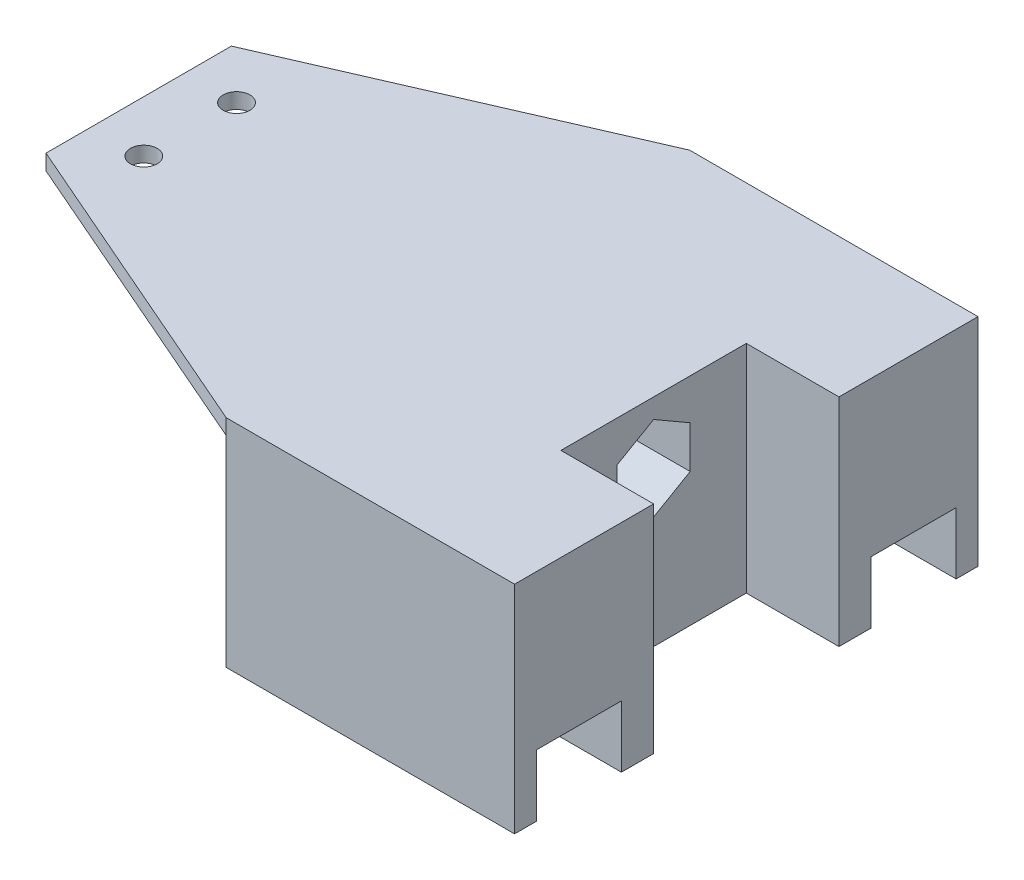
ISO-10303-21;
HEADER;
FILE_DESCRIPTION(('STEP AP214'),'2;1');
FILE_NAME('part.step','',(''),(''),'','','');
FILE_SCHEMA(('AUTOMOTIVE_DESIGN { 1 0 10303 214 1 1 1 1 }'));
ENDSEC;
DATA;
#1=APPLICATION_CONTEXT('core data for automotive mechanical design processes');
#2=APPLICATION_PROTOCOL_DEFINITION('international standard','automotive_design',2000,#1);
#3=PRODUCT_CONTEXT('',#1,'mechanical');
#4=PRODUCT('Part','Part','',(#3));
#5=PRODUCT_RELATED_PRODUCT_CATEGORY('part','',(#4));
#6=PRODUCT_DEFINITION_FORMATION('','',#4);
#7=PRODUCT_DEFINITION_CONTEXT('part definition',#1,'design');
#8=PRODUCT_DEFINITION('design','',#6,#7);
#9=PRODUCT_DEFINITION_SHAPE('','',#8);
#10=(LENGTH_UNIT() NAMED_UNIT(*) SI_UNIT(.MILLI.,.METRE.));
#11=(NAMED_UNIT(*) PLANE_ANGLE_UNIT() SI_UNIT($,.RADIAN.));
#12=(NAMED_UNIT(*) SI_UNIT($,.STERADIAN.) SOLID_ANGLE_UNIT());
#13=UNCERTAINTY_MEASURE_WITH_UNIT(LENGTH_MEASURE(1.E-05),#10,'distance_accuracy_value','');
#14=(GEOMETRIC_REPRESENTATION_CONTEXT(3) GLOBAL_UNCERTAINTY_ASSIGNED_CONTEXT((#13)) GLOBAL_UNIT_ASSIGNED_CONTEXT((#10,
#11,#12)) REPRESENTATION_CONTEXT('',''));
#15=CARTESIAN_POINT('',(0.,0.,0.));
#16=DIRECTION('',(0.,0.,1.));
#17=DIRECTION('',(1.,0.,0.));
#18=AXIS2_PLACEMENT_3D('',#15,#16,#17);
#19=CARTESIAN_POINT('',(-14.,0.,0.));
#20=DIRECTION('',(-1.,0.,0.));
#21=DIRECTION('',(0.,0.,1.));
#22=AXIS2_PLACEMENT_3D('',#19,#20,#21);
#23=PLANE('',#22);
#24=DIRECTION('',(0.,-1.,0.));
#25=VECTOR('',#24,1.);
#26=CARTESIAN_POINT('',(-14.,0.,22.5));
#27=LINE('',#26,#25);
#28=CARTESIAN_POINT('',(-14.,19.5,22.5));
#29=VERTEX_POINT('',#28);
#30=CARTESIAN_POINT('',(-14.,0.,22.5));
#31=VERTEX_POINT('',#30);
#32=EDGE_CURVE('E60',#29,#31,#27,.T.);
#33=ORIENTED_EDGE('',*,*,#32,.F.);
#34=DIRECTION('',(0.,0.,-1.));
#35=VECTOR('',#34,1.);
#36=CARTESIAN_POINT('',(-14.,19.5,0.));
#37=LINE('',#36,#35);
#38=CARTESIAN_POINT('',(-14.,19.5,9.00000000000001));
#39=VERTEX_POINT('',#38);
#40=EDGE_CURVE('E274',#29,#39,#37,.T.);
#41=ORIENTED_EDGE('',*,*,#40,.T.);
#42=DIRECTION('',(0.,1.,0.));
#43=VECTOR('',#42,1.);
#44=CARTESIAN_POINT('',(-14.,0.,9.00000000000001));
#45=LINE('',#44,#43);
#46=CARTESIAN_POINT('',(-14.,0.,9.00000000000001));
#47=VERTEX_POINT('',#46);
#48=EDGE_CURVE('E332',#47,#39,#45,.T.);
#49=ORIENTED_EDGE('',*,*,#48,.F.);
#50=DIRECTION('',(0.,0.,-1.));
#51=VECTOR('',#50,1.);
#52=CARTESIAN_POINT('',(-14.,0.,12.125));
#53=LINE('',#52,#51);
#54=CARTESIAN_POINT('',(-14.,0.,12.125));
#55=VERTEX_POINT('',#54);
#56=EDGE_CURVE('E394',#55,#47,#53,.T.);
#57=ORIENTED_EDGE('',*,*,#56,.F.);
#58=DIRECTION('',(0.,-1.,0.));
#59=VECTOR('',#58,1.);
#60=CARTESIAN_POINT('',(-14.,0.,12.125));
#61=LINE('',#60,#59);
#62=CARTESIAN_POINT('',(-14.,6.,12.125));
#63=VERTEX_POINT('',#62);
#64=EDGE_CURVE('E391',#63,#55,#61,.T.);
#65=ORIENTED_EDGE('',*,*,#64,.F.);
#66=DIRECTION('',(0.,0.,-1.));
#67=VECTOR('',#66,1.);
#68=CARTESIAN_POINT('',(-14.,6.,20.375));
#69=LINE('',#68,#67);
#70=CARTESIAN_POINT('',(-14.,6.,20.375));
#71=VERTEX_POINT('',#70);
#72=EDGE_CURVE('E389',#71,#63,#69,.T.);
#73=ORIENTED_EDGE('',*,*,#72,.F.);
#74=DIRECTION('',(0.,1.,0.));
#75=VECTOR('',#74,1.);
#76=CARTESIAN_POINT('',(-14.,0.,20.375));
#77=LINE('',#76,#75);
#78=CARTESIAN_POINT('',(-14.,0.,20.375));
#79=VERTEX_POINT('',#78);
#80=EDGE_CURVE('E387',#79,#71,#77,.T.);
#81=ORIENTED_EDGE('',*,*,#80,.F.);
#82=DIRECTION('',(0.,0.,-1.));
#83=VECTOR('',#82,1.);
#84=CARTESIAN_POINT('',(-14.,0.,20.375));
#85=LINE('',#84,#83);
#86=EDGE_CURVE('E353',#31,#79,#85,.T.);
#87=ORIENTED_EDGE('',*,*,#86,.F.);
#88=EDGE_LOOP('',(#33,#41,#49,#57,#65,#73,#81,#87));
#89=FACE_BOUND('',#88,.T.);
#90=ADVANCED_FACE('F37',(#89),#23,.T.);
#91=DIRECTION('',(0.,-1.,0.));
#92=VECTOR('',#91,1.);
#93=CARTESIAN_POINT('',(-14.,0.,-8.99999999999999));
#94=LINE('',#93,#92);
#95=CARTESIAN_POINT('',(-14.,19.5,-8.99999999999999));
#96=VERTEX_POINT('',#95);
#97=CARTESIAN_POINT('',(-14.,0.,-8.99999999999999));
#98=VERTEX_POINT('',#97);
#99=EDGE_CURVE('E330',#96,#98,#94,.T.);
#100=ORIENTED_EDGE('',*,*,#99,.F.);
#101=DIRECTION('',(0.,0.,-1.));
#102=VECTOR('',#101,1.);
#103=CARTESIAN_POINT('',(-14.,19.5,0.));
#104=LINE('',#103,#102);
#105=CARTESIAN_POINT('',(-14.,19.5,-22.5));
#106=VERTEX_POINT('',#105);
#107=EDGE_CURVE('E52',#96,#106,#104,.T.);
#108=ORIENTED_EDGE('',*,*,#107,.T.);
#109=DIRECTION('',(0.,1.,0.));
#110=VECTOR('',#109,1.);
#111=CARTESIAN_POINT('',(-14.,0.,-22.5));
#112=LINE('',#111,#110);
#113=CARTESIAN_POINT('',(-14.,0.,-22.5));
#114=VERTEX_POINT('',#113);
#115=EDGE_CURVE('E405',#114,#106,#112,.T.);
#116=ORIENTED_EDGE('',*,*,#115,.F.);
#117=DIRECTION('',(0.,0.,-1.));
#118=VECTOR('',#117,1.);
#119=CARTESIAN_POINT('',(-14.,0.,-20.375));
#120=LINE('',#119,#118);
#121=CARTESIAN_POINT('',(-14.,0.,-20.375));
#122=VERTEX_POINT('',#121);
#123=EDGE_CURVE('E403',#122,#114,#120,.T.);
#124=ORIENTED_EDGE('',*,*,#123,.F.);
#125=DIRECTION('',(0.,-1.,0.));
#126=VECTOR('',#125,1.);
#127=CARTESIAN_POINT('',(-14.,0.,-20.375));
#128=LINE('',#127,#126);
#129=CARTESIAN_POINT('',(-14.,6.,-20.375));
#130=VERTEX_POINT('',#129);
#131=EDGE_CURVE('E401',#130,#122,#128,.T.);
#132=ORIENTED_EDGE('',*,*,#131,.F.);
#133=DIRECTION('',(0.,0.,-1.));
#134=VECTOR('',#133,1.);
#135=CARTESIAN_POINT('',(-14.,6.,-20.375));
#136=LINE('',#135,#134);
#137=CARTESIAN_POINT('',(-14.,6.,-12.125));
#138=VERTEX_POINT('',#137);
#139=EDGE_CURVE('E399',#138,#130,#136,.T.);
#140=ORIENTED_EDGE('',*,*,#139,.F.);
#141=DIRECTION('',(0.,1.,0.));
#142=VECTOR('',#141,1.);
#143=CARTESIAN_POINT('',(-14.,0.,-12.125));
#144=LINE('',#143,#142);
#145=CARTESIAN_POINT('',(-14.,0.,-12.125));
#146=VERTEX_POINT('',#145);
#147=EDGE_CURVE('E397',#146,#138,#144,.T.);
#148=ORIENTED_EDGE('',*,*,#147,.F.);
#149=EDGE_CURVE('E393',#98,#146,#53,.T.);
#150=ORIENTED_EDGE('',*,*,#149,.F.);
#151=EDGE_LOOP('',(#100,#108,#116,#124,#132,#140,#148,#150));
#152=FACE_BOUND('',#151,.T.);
#153=ADVANCED_FACE('F531',(#152),#23,.T.);
#154=CARTESIAN_POINT('',(-5.,-25.4558441227157,-8.99999999999999));
#155=DIRECTION('',(1.,0.,0.));
#156=DIRECTION('',(0.,0.,-1.));
#157=AXIS2_PLACEMENT_3D('',#154,#155,#156);
#158=PLANE('',#157);
#159=DIRECTION('',(0.,-0.5,-0.866025403784439));
#160=VECTOR('',#159,1.);
#161=CARTESIAN_POINT('',(-5.,12.9504065443768,3.54999999999999));
#162=LINE('',#161,#160);
#163=CARTESIAN_POINT('',(-5.,12.9504065443768,3.54999999999999));
#164=VERTEX_POINT('',#163);
#165=CARTESIAN_POINT('',(-5.,10.9008130887537,0.));
#166=VERTEX_POINT('',#165);
#167=EDGE_CURVE('E322',#164,#166,#162,.T.);
#168=ORIENTED_EDGE('',*,*,#167,.T.);
#169=DIRECTION('',(0.,0.5,-0.866025403784438));
#170=VECTOR('',#169,1.);
#171=CARTESIAN_POINT('',(-5.,10.9008130887537,0.));
#172=LINE('',#171,#170);
#173=CARTESIAN_POINT('',(-5.,12.9504065443768,-3.55000000000001));
#174=VERTEX_POINT('',#173);
#175=EDGE_CURVE('E320',#166,#174,#172,.T.);
#176=ORIENTED_EDGE('',*,*,#175,.T.);
#177=DIRECTION('',(0.,1.,0.));
#178=VECTOR('',#177,1.);
#179=CARTESIAN_POINT('',(-5.,12.9504065443768,-3.55000000000001));
#180=LINE('',#179,#178);
#181=CARTESIAN_POINT('',(-5.,17.0495934556232,-3.55000000000001));
#182=VERTEX_POINT('',#181);
#183=EDGE_CURVE('E318',#174,#182,#180,.T.);
#184=ORIENTED_EDGE('',*,*,#183,.T.);
#185=DIRECTION('',(0.,0.5,0.866025403784438));
#186=VECTOR('',#185,1.);
#187=CARTESIAN_POINT('',(-5.,17.0495934556232,-3.55));
#188=LINE('',#187,#186);
#189=CARTESIAN_POINT('',(-5.,19.0991869112463,0.));
#190=VERTEX_POINT('',#189);
#191=EDGE_CURVE('E316',#182,#190,#188,.T.);
#192=ORIENTED_EDGE('',*,*,#191,.T.);
#193=DIRECTION('',(0.,-0.500000000000001,0.866025403784438));
#194=VECTOR('',#193,1.);
#195=CARTESIAN_POINT('',(-5.,19.0991869112463,0.));
#196=LINE('',#195,#194);
#197=CARTESIAN_POINT('',(-5.,17.0495934556232,3.54999999999999));
#198=VERTEX_POINT('',#197);
#199=EDGE_CURVE('E314',#190,#198,#196,.T.);
#200=ORIENTED_EDGE('',*,*,#199,.T.);
#201=DIRECTION('',(0.,-1.,0.));
#202=VECTOR('',#201,1.);
#203=CARTESIAN_POINT('',(-5.,17.0495934556232,3.54999999999999));
#204=LINE('',#203,#202);
#205=EDGE_CURVE('E444',#198,#164,#204,.T.);
#206=ORIENTED_EDGE('',*,*,#205,.T.);
#207=EDGE_LOOP('',(#168,#176,#184,#192,#200,#206));
#208=FACE_BOUND('',#207,.T.);
#209=DIRECTION('',(0.,0.,-1.));
#210=VECTOR('',#209,1.);
#211=CARTESIAN_POINT('',(-5.,19.5,9.));
#212=LINE('',#211,#210);
#213=CARTESIAN_POINT('',(-5.,19.5,9.00000000000001));
#214=VERTEX_POINT('',#213);
#215=CARTESIAN_POINT('',(-5.,19.5,-8.99999999999999));
#216=VERTEX_POINT('',#215);
#217=EDGE_CURVE('E255',#214,#216,#212,.T.);
#218=ORIENTED_EDGE('',*,*,#217,.T.);
#219=DIRECTION('',(0.,1.,0.));
#220=VECTOR('',#219,1.);
#221=CARTESIAN_POINT('',(-5.,-25.4558441227157,-8.99999999999999));
#222=LINE('',#221,#220);
#223=CARTESIAN_POINT('',(-5.00000000000001,0.,-8.99999999999999));
#224=VERTEX_POINT('',#223);
#225=EDGE_CURVE('E285',#224,#216,#222,.T.);
#226=ORIENTED_EDGE('',*,*,#225,.F.);
#227=DIRECTION('',(0.,0.,1.));
#228=VECTOR('',#227,1.);
#229=CARTESIAN_POINT('',(-5.,0.,-8.99999999999999));
#230=LINE('',#229,#228);
#231=CARTESIAN_POINT('',(-5.,0.,9.00000000000001));
#232=VERTEX_POINT('',#231);
#233=EDGE_CURVE('E279',#224,#232,#230,.T.);
#234=ORIENTED_EDGE('',*,*,#233,.T.);
#235=DIRECTION('',(0.,1.,0.));
#236=VECTOR('',#235,1.);
#237=CARTESIAN_POINT('',(-5.,-25.4558441227157,9.00000000000001));
#238=LINE('',#237,#236);
#239=EDGE_CURVE('E280',#232,#214,#238,.T.);
#240=ORIENTED_EDGE('',*,*,#239,.T.);
#241=EDGE_LOOP('',(#218,#226,#234,#240));
#242=FACE_BOUND('',#241,.T.);
#243=ADVANCED_FACE('F537',(#208,#242),#158,.F.);
#244=CARTESIAN_POINT('',(-23.,-25.4558441227157,9.00000000000001));
#245=DIRECTION('',(0.,0.,1.));
#246=DIRECTION('',(1.,0.,0.));
#247=AXIS2_PLACEMENT_3D('',#244,#245,#246);
#248=PLANE('',#247);
#249=DIRECTION('',(-1.,0.,0.));
#250=VECTOR('',#249,1.);
#251=CARTESIAN_POINT('',(-23.,19.5,9.00000000000001));
#252=LINE('',#251,#250);
#253=EDGE_CURVE('E271',#214,#39,#252,.T.);
#254=ORIENTED_EDGE('',*,*,#253,.F.);
#255=ORIENTED_EDGE('',*,*,#239,.F.);
#256=DIRECTION('',(-1.,0.,0.));
#257=VECTOR('',#256,1.);
#258=CARTESIAN_POINT('',(-23.,0.,9.00000000000001));
#259=LINE('',#258,#257);
#260=EDGE_CURVE('E277',#232,#47,#259,.T.);
#261=ORIENTED_EDGE('',*,*,#260,.T.);
#262=ORIENTED_EDGE('',*,*,#48,.T.);
#263=EDGE_LOOP('',(#254,#255,#261,#262));
#264=FACE_BOUND('',#263,.T.);
#265=ADVANCED_FACE('F476',(#264),#248,.F.);
#266=CARTESIAN_POINT('',(-23.,-25.4558441227157,-8.99999999999999));
#267=DIRECTION('',(0.,0.,-1.));
#268=DIRECTION('',(-1.,0.,0.));
#269=AXIS2_PLACEMENT_3D('',#266,#267,#268);
#270=PLANE('',#269);
#271=DIRECTION('',(1.,0.,0.));
#272=VECTOR('',#271,1.);
#273=CARTESIAN_POINT('',(-23.,19.5,-8.99999999999999));
#274=LINE('',#273,#272);
#275=EDGE_CURVE('E11',#96,#216,#274,.T.);
#276=ORIENTED_EDGE('',*,*,#275,.F.);
#277=ORIENTED_EDGE('',*,*,#99,.T.);
#278=DIRECTION('',(1.,0.,0.));
#279=VECTOR('',#278,1.);
#280=CARTESIAN_POINT('',(-23.,0.,-8.99999999999999));
#281=LINE('',#280,#279);
#282=EDGE_CURVE('E282',#98,#224,#281,.T.);
#283=ORIENTED_EDGE('',*,*,#282,.T.);
#284=ORIENTED_EDGE('',*,*,#225,.T.);
#285=EDGE_LOOP('',(#276,#277,#283,#284));
#286=FACE_BOUND('',#285,.T.);
#287=ADVANCED_FACE('F535',(#286),#270,.F.);
#288=CARTESIAN_POINT('',(14.,0.,0.));
#289=DIRECTION('',(-1.,0.,0.));
#290=DIRECTION('',(0.,0.,1.));
#291=AXIS2_PLACEMENT_3D('',#288,#289,#290);
#292=PLANE('',#291);
#293=DIRECTION('',(0.,0.,-1.));
#294=VECTOR('',#293,1.);
#295=CARTESIAN_POINT('',(14.,0.,12.125));
#296=LINE('',#295,#294);
#297=CARTESIAN_POINT('',(14.,0.,12.125));
#298=VERTEX_POINT('',#297);
#299=CARTESIAN_POINT('',(14.,0.,9.00000000000001));
#300=VERTEX_POINT('',#299);
#301=EDGE_CURVE('E365',#298,#300,#296,.T.);
#302=ORIENTED_EDGE('',*,*,#301,.T.);
#303=DIRECTION('',(0.,1.,0.));
#304=VECTOR('',#303,1.);
#305=CARTESIAN_POINT('',(14.,0.,9.00000000000001));
#306=LINE('',#305,#304);
#307=CARTESIAN_POINT('',(14.,21.,9.00000000000001));
#308=VERTEX_POINT('',#307);
#309=EDGE_CURVE('E327',#300,#308,#306,.T.);
#310=ORIENTED_EDGE('',*,*,#309,.T.);
#311=DIRECTION('',(0.,0.,1.));
#312=VECTOR('',#311,1.);
#313=CARTESIAN_POINT('',(14.,21.,22.5));
#314=LINE('',#313,#312);
#315=CARTESIAN_POINT('',(14.,21.,22.5));
#316=VERTEX_POINT('',#315);
#317=EDGE_CURVE('E378',#308,#316,#314,.T.);
#318=ORIENTED_EDGE('',*,*,#317,.T.);
#319=DIRECTION('',(0.,-1.,0.));
#320=VECTOR('',#319,1.);
#321=CARTESIAN_POINT('',(14.,0.,22.5));
#322=LINE('',#321,#320);
#323=CARTESIAN_POINT('',(14.,0.,22.5));
#324=VERTEX_POINT('',#323);
#325=EDGE_CURVE('E382',#316,#324,#322,.T.);
#326=ORIENTED_EDGE('',*,*,#325,.T.);
#327=DIRECTION('',(0.,0.,-1.));
#328=VECTOR('',#327,1.);
#329=CARTESIAN_POINT('',(14.,0.,20.375));
#330=LINE('',#329,#328);
#331=CARTESIAN_POINT('',(14.,0.,20.375));
#332=VERTEX_POINT('',#331);
#333=EDGE_CURVE('E354',#324,#332,#330,.T.);
#334=ORIENTED_EDGE('',*,*,#333,.T.);
#335=DIRECTION('',(0.,1.,0.));
#336=VECTOR('',#335,1.);
#337=CARTESIAN_POINT('',(14.,0.,20.375));
#338=LINE('',#337,#336);
#339=CARTESIAN_POINT('',(14.,6.,20.375));
#340=VERTEX_POINT('',#339);
#341=EDGE_CURVE('E357',#332,#340,#338,.T.);
#342=ORIENTED_EDGE('',*,*,#341,.T.);
#343=DIRECTION('',(0.,0.,-1.));
#344=VECTOR('',#343,1.);
#345=CARTESIAN_POINT('',(14.,6.,20.375));
#346=LINE('',#345,#344);
#347=CARTESIAN_POINT('',(14.,6.,12.125));
#348=VERTEX_POINT('',#347);
#349=EDGE_CURVE('E360',#340,#348,#346,.T.);
#350=ORIENTED_EDGE('',*,*,#349,.T.);
#351=DIRECTION('',(0.,-1.,0.));
#352=VECTOR('',#351,1.);
#353=CARTESIAN_POINT('',(14.,0.,12.125));
#354=LINE('',#353,#352);
#355=EDGE_CURVE('E362',#348,#298,#354,.T.);
#356=ORIENTED_EDGE('',*,*,#355,.T.);
#357=EDGE_LOOP('',(#302,#310,#318,#326,#334,#342,#350,#356));
#358=FACE_BOUND('',#357,.T.);
#359=ADVANCED_FACE('F501',(#358),#292,.F.);
#360=CARTESIAN_POINT('',(14.,21.,-22.5));
#361=VERTEX_POINT('',#360);
#362=CARTESIAN_POINT('',(14.,21.,-9.));
#363=VERTEX_POINT('',#362);
#364=EDGE_CURVE('E379',#361,#363,#314,.T.);
#365=ORIENTED_EDGE('',*,*,#364,.T.);
#366=DIRECTION('',(0.,-1.,0.));
#367=VECTOR('',#366,1.);
#368=CARTESIAN_POINT('',(14.,0.,-8.99999999999999));
#369=LINE('',#368,#367);
#370=CARTESIAN_POINT('',(14.,0.,-8.99999999999999));
#371=VERTEX_POINT('',#370);
#372=EDGE_CURVE('E324',#363,#371,#369,.T.);
#373=ORIENTED_EDGE('',*,*,#372,.T.);
#374=CARTESIAN_POINT('',(14.,0.,-12.125));
#375=VERTEX_POINT('',#374);
#376=EDGE_CURVE('E364',#371,#375,#296,.T.);
#377=ORIENTED_EDGE('',*,*,#376,.T.);
#378=DIRECTION('',(0.,1.,0.));
#379=VECTOR('',#378,1.);
#380=CARTESIAN_POINT('',(14.,0.,-12.125));
#381=LINE('',#380,#379);
#382=CARTESIAN_POINT('',(14.,6.,-12.125));
#383=VERTEX_POINT('',#382);
#384=EDGE_CURVE('E368',#375,#383,#381,.T.);
#385=ORIENTED_EDGE('',*,*,#384,.T.);
#386=DIRECTION('',(0.,0.,-1.));
#387=VECTOR('',#386,1.);
#388=CARTESIAN_POINT('',(14.,6.,-20.375));
#389=LINE('',#388,#387);
#390=CARTESIAN_POINT('',(14.,6.,-20.375));
#391=VERTEX_POINT('',#390);
#392=EDGE_CURVE('E370',#383,#391,#389,.T.);
#393=ORIENTED_EDGE('',*,*,#392,.T.);
#394=DIRECTION('',(0.,-1.,0.));
#395=VECTOR('',#394,1.);
#396=CARTESIAN_POINT('',(14.,0.,-20.375));
#397=LINE('',#396,#395);
#398=CARTESIAN_POINT('',(14.,0.,-20.375));
#399=VERTEX_POINT('',#398);
#400=EDGE_CURVE('E372',#391,#399,#397,.T.);
#401=ORIENTED_EDGE('',*,*,#400,.T.);
#402=DIRECTION('',(0.,0.,-1.));
#403=VECTOR('',#402,1.);
#404=CARTESIAN_POINT('',(14.,0.,-20.375));
#405=LINE('',#404,#403);
#406=CARTESIAN_POINT('',(14.,0.,-22.5));
#407=VERTEX_POINT('',#406);
#408=EDGE_CURVE('E374',#399,#407,#405,.T.);
#409=ORIENTED_EDGE('',*,*,#408,.T.);
#410=DIRECTION('',(0.,1.,0.));
#411=VECTOR('',#410,1.);
#412=CARTESIAN_POINT('',(14.,0.,-22.5));
#413=LINE('',#412,#411);
#414=EDGE_CURVE('E376',#407,#361,#413,.T.);
#415=ORIENTED_EDGE('',*,*,#414,.T.);
#416=EDGE_LOOP('',(#365,#373,#377,#385,#393,#401,#409,#415));
#417=FACE_BOUND('',#416,.T.);
#418=ADVANCED_FACE('F455',(#417),#292,.F.);
#419=CARTESIAN_POINT('',(14.,0.,20.375));
#420=DIRECTION('',(0.,1.,0.));
#421=DIRECTION('',(0.,0.,1.));
#422=AXIS2_PLACEMENT_3D('',#419,#420,#421);
#423=PLANE('',#422);
#424=ORIENTED_EDGE('',*,*,#86,.T.);
#425=DIRECTION('',(-1.,0.,0.));
#426=VECTOR('',#425,1.);
#427=CARTESIAN_POINT('',(14.,0.,20.375));
#428=LINE('',#427,#426);
#429=EDGE_CURVE('E439',#332,#79,#428,.T.);
#430=ORIENTED_EDGE('',*,*,#429,.F.);
#431=ORIENTED_EDGE('',*,*,#333,.F.);
#432=DIRECTION('',(-1.,0.,0.));
#433=VECTOR('',#432,1.);
#434=CARTESIAN_POINT('',(14.,0.,22.5));
#435=LINE('',#434,#433);
#436=EDGE_CURVE('E384',#324,#31,#435,.T.);
#437=ORIENTED_EDGE('',*,*,#436,.T.);
#438=EDGE_LOOP('',(#424,#430,#431,#437));
#439=FACE_BOUND('',#438,.T.);
#440=ADVANCED_FACE('F39',(#439),#423,.F.);
#441=CARTESIAN_POINT('',(14.,0.,20.375));
#442=DIRECTION('',(0.,0.,1.));
#443=DIRECTION('',(1.,0.,0.));
#444=AXIS2_PLACEMENT_3D('',#441,#442,#443);
#445=PLANE('',#444);
#446=ORIENTED_EDGE('',*,*,#80,.T.);
#447=DIRECTION('',(-1.,0.,0.));
#448=VECTOR('',#447,1.);
#449=CARTESIAN_POINT('',(14.,6.,20.375));
#450=LINE('',#449,#448);
#451=EDGE_CURVE('E436',#340,#71,#450,.T.);
#452=ORIENTED_EDGE('',*,*,#451,.F.);
#453=ORIENTED_EDGE('',*,*,#341,.F.);
#454=ORIENTED_EDGE('',*,*,#429,.T.);
#455=EDGE_LOOP('',(#446,#452,#453,#454));
#456=FACE_BOUND('',#455,.T.);
#457=ADVANCED_FACE('F496',(#456),#445,.F.);
#458=CARTESIAN_POINT('',(14.,6.,20.375));
#459=DIRECTION('',(0.,1.,0.));
#460=DIRECTION('',(0.,0.,1.));
#461=AXIS2_PLACEMENT_3D('',#458,#459,#460);
#462=PLANE('',#461);
#463=ORIENTED_EDGE('',*,*,#72,.T.);
#464=DIRECTION('',(-1.,0.,0.));
#465=VECTOR('',#464,1.);
#466=CARTESIAN_POINT('',(14.,6.,12.125));
#467=LINE('',#466,#465);
#468=EDGE_CURVE('E433',#348,#63,#467,.T.);
#469=ORIENTED_EDGE('',*,*,#468,.F.);
#470=ORIENTED_EDGE('',*,*,#349,.F.);
#471=ORIENTED_EDGE('',*,*,#451,.T.);
#472=EDGE_LOOP('',(#463,#469,#470,#471));
#473=FACE_BOUND('',#472,.T.);
#474=ADVANCED_FACE('F493',(#473),#462,.F.);
#475=CARTESIAN_POINT('',(14.,0.,12.125));
#476=DIRECTION('',(0.,0.,-1.));
#477=DIRECTION('',(-1.,0.,0.));
#478=AXIS2_PLACEMENT_3D('',#475,#476,#477);
#479=PLANE('',#478);
#480=ORIENTED_EDGE('',*,*,#64,.T.);
#481=DIRECTION('',(-1.,0.,0.));
#482=VECTOR('',#481,1.);
#483=CARTESIAN_POINT('',(14.,0.,12.125));
#484=LINE('',#483,#482);
#485=EDGE_CURVE('E430',#298,#55,#484,.T.);
#486=ORIENTED_EDGE('',*,*,#485,.F.);
#487=ORIENTED_EDGE('',*,*,#355,.F.);
#488=ORIENTED_EDGE('',*,*,#468,.T.);
#489=EDGE_LOOP('',(#480,#486,#487,#488));
#490=FACE_BOUND('',#489,.T.);
#491=ADVANCED_FACE('F488',(#490),#479,.F.);
#492=CARTESIAN_POINT('',(14.,0.,12.125));
#493=DIRECTION('',(0.,1.,0.));
#494=DIRECTION('',(0.,0.,1.));
#495=AXIS2_PLACEMENT_3D('',#492,#493,#494);
#496=PLANE('',#495);
#497=ORIENTED_EDGE('',*,*,#56,.T.);
#498=ORIENTED_EDGE('',*,*,#260,.F.);
#499=ORIENTED_EDGE('',*,*,#233,.F.);
#500=ORIENTED_EDGE('',*,*,#282,.F.);
#501=ORIENTED_EDGE('',*,*,#149,.T.);
#502=DIRECTION('',(-1.,0.,0.));
#503=VECTOR('',#502,1.);
#504=CARTESIAN_POINT('',(14.,0.,-12.125));
#505=LINE('',#504,#503);
#506=EDGE_CURVE('E427',#375,#146,#505,.T.);
#507=ORIENTED_EDGE('',*,*,#506,.F.);
#508=ORIENTED_EDGE('',*,*,#376,.F.);
#509=DIRECTION('',(1.,0.,0.));
#510=VECTOR('',#509,1.);
#511=CARTESIAN_POINT('',(5.,0.,-8.99999999999999));
#512=LINE('',#511,#510);
#513=CARTESIAN_POINT('',(5.,0.,-8.99999999999999));
#514=VERTEX_POINT('',#513);
#515=EDGE_CURVE('E288',#514,#371,#512,.T.);
#516=ORIENTED_EDGE('',*,*,#515,.F.);
#517=DIRECTION('',(0.,0.,-1.));
#518=VECTOR('',#517,1.);
#519=CARTESIAN_POINT('',(5.,0.,-8.99999999999999));
#520=LINE('',#519,#518);
#521=CARTESIAN_POINT('',(5.,0.,9.));
#522=VERTEX_POINT('',#521);
#523=EDGE_CURVE('E291',#522,#514,#520,.T.);
#524=ORIENTED_EDGE('',*,*,#523,.F.);
#525=DIRECTION('',(-1.,0.,0.));
#526=VECTOR('',#525,1.);
#527=CARTESIAN_POINT('',(5.,0.,9.00000000000001));
#528=LINE('',#527,#526);
#529=EDGE_CURVE('E293',#300,#522,#528,.T.);
#530=ORIENTED_EDGE('',*,*,#529,.F.);
#531=ORIENTED_EDGE('',*,*,#301,.F.);
#532=ORIENTED_EDGE('',*,*,#485,.T.);
#533=EDGE_LOOP('',(#497,#498,#499,#500,#501,#507,#508,#516,#524,#530,#531,#532));
#534=FACE_BOUND('',#533,.T.);
#535=ADVANCED_FACE('F481',(#534),#496,.F.);
#536=CARTESIAN_POINT('',(14.,0.,-12.125));
#537=DIRECTION('',(0.,0.,1.));
#538=DIRECTION('',(1.,0.,0.));
#539=AXIS2_PLACEMENT_3D('',#536,#537,#538);
#540=PLANE('',#539);
#541=ORIENTED_EDGE('',*,*,#147,.T.);
#542=DIRECTION('',(-1.,0.,0.));
#543=VECTOR('',#542,1.);
#544=CARTESIAN_POINT('',(14.,6.,-12.125));
#545=LINE('',#544,#543);
#546=EDGE_CURVE('E424',#383,#138,#545,.T.);
#547=ORIENTED_EDGE('',*,*,#546,.F.);
#548=ORIENTED_EDGE('',*,*,#384,.F.);
#549=ORIENTED_EDGE('',*,*,#506,.T.);
#550=EDGE_LOOP('',(#541,#547,#548,#549));
#551=FACE_BOUND('',#550,.T.);
#552=ADVANCED_FACE('F518',(#551),#540,.F.);
#553=CARTESIAN_POINT('',(14.,6.,-20.375));
#554=DIRECTION('',(0.,1.,0.));
#555=DIRECTION('',(0.,0.,1.));
#556=AXIS2_PLACEMENT_3D('',#553,#554,#555);
#557=PLANE('',#556);
#558=ORIENTED_EDGE('',*,*,#139,.T.);
#559=DIRECTION('',(-1.,0.,0.));
#560=VECTOR('',#559,1.);
#561=CARTESIAN_POINT('',(14.,6.,-20.375));
#562=LINE('',#561,#560);
#563=EDGE_CURVE('E421',#391,#130,#562,.T.);
#564=ORIENTED_EDGE('',*,*,#563,.F.);
#565=ORIENTED_EDGE('',*,*,#392,.F.);
#566=ORIENTED_EDGE('',*,*,#546,.T.);
#567=EDGE_LOOP('',(#558,#564,#565,#566));
#568=FACE_BOUND('',#567,.T.);
#569=ADVANCED_FACE('F522',(#568),#557,.F.);
#570=CARTESIAN_POINT('',(14.,0.,-20.375));
#571=DIRECTION('',(0.,0.,-1.));
#572=DIRECTION('',(-1.,0.,0.));
#573=AXIS2_PLACEMENT_3D('',#570,#571,#572);
#574=PLANE('',#573);
#575=ORIENTED_EDGE('',*,*,#131,.T.);
#576=DIRECTION('',(-1.,0.,0.));
#577=VECTOR('',#576,1.);
#578=CARTESIAN_POINT('',(14.,0.,-20.375));
#579=LINE('',#578,#577);
#580=EDGE_CURVE('E418',#399,#122,#579,.T.);
#581=ORIENTED_EDGE('',*,*,#580,.F.);
#582=ORIENTED_EDGE('',*,*,#400,.F.);
#583=ORIENTED_EDGE('',*,*,#563,.T.);
#584=EDGE_LOOP('',(#575,#581,#582,#583));
#585=FACE_BOUND('',#584,.T.);
#586=ADVANCED_FACE('F527',(#585),#574,.F.);
#587=CARTESIAN_POINT('',(14.,0.,-20.375));
#588=DIRECTION('',(0.,1.,0.));
#589=DIRECTION('',(0.,0.,1.));
#590=AXIS2_PLACEMENT_3D('',#587,#588,#589);
#591=PLANE('',#590);
#592=ORIENTED_EDGE('',*,*,#123,.T.);
#593=DIRECTION('',(-1.,0.,0.));
#594=VECTOR('',#593,1.);
#595=CARTESIAN_POINT('',(14.,0.,-22.5));
#596=LINE('',#595,#594);
#597=EDGE_CURVE('E415',#407,#114,#596,.T.);
#598=ORIENTED_EDGE('',*,*,#597,.F.);
#599=ORIENTED_EDGE('',*,*,#408,.F.);
#600=ORIENTED_EDGE('',*,*,#580,.T.);
#601=EDGE_LOOP('',(#592,#598,#599,#600));
#602=FACE_BOUND('',#601,.T.);
#603=ADVANCED_FACE('F530',(#602),#591,.F.);
#604=CARTESIAN_POINT('',(14.,0.,-22.5));
#605=DIRECTION('',(0.,0.,1.));
#606=DIRECTION('',(0.,-1.,0.));
#607=AXIS2_PLACEMENT_3D('',#604,#605,#606);
#608=PLANE('',#607);
#609=ORIENTED_EDGE('',*,*,#115,.T.);
#610=DIRECTION('',(0.,1.,0.));
#611=VECTOR('',#610,1.);
#612=CARTESIAN_POINT('',(-14.,19.5,-22.5));
#613=LINE('',#612,#611);
#614=CARTESIAN_POINT('',(-14.,21.,-22.5));
#615=VERTEX_POINT('',#614);
#616=EDGE_CURVE('E242',#106,#615,#613,.T.);
#617=ORIENTED_EDGE('',*,*,#616,.T.);
#618=DIRECTION('',(-1.,0.,0.));
#619=VECTOR('',#618,1.);
#620=CARTESIAN_POINT('',(14.,21.,-22.5));
#621=LINE('',#620,#619);
#622=EDGE_CURVE('E412',#361,#615,#621,.T.);
#623=ORIENTED_EDGE('',*,*,#622,.F.);
#624=ORIENTED_EDGE('',*,*,#414,.F.);
#625=ORIENTED_EDGE('',*,*,#597,.T.);
#626=EDGE_LOOP('',(#609,#617,#623,#624,#625));
#627=FACE_BOUND('',#626,.T.);
#628=ADVANCED_FACE('F462',(#627),#608,.F.);
#629=CARTESIAN_POINT('',(14.,21.,22.5));
#630=DIRECTION('',(0.,-1.,0.));
#631=DIRECTION('',(0.,0.,-1.));
#632=AXIS2_PLACEMENT_3D('',#629,#630,#631);
#633=PLANE('',#632);
#634=DIRECTION('',(0.916834798939161,0.,0.399266767279957));
#635=VECTOR('',#634,1.);
#636=CARTESIAN_POINT('',(-14.,21.,22.5));
#637=LINE('',#636,#635);
#638=CARTESIAN_POINT('',(-45.,21.,9.00000000000001));
#639=VERTEX_POINT('',#638);
#640=CARTESIAN_POINT('',(-14.,21.,22.5));
#641=VERTEX_POINT('',#640);
#642=EDGE_CURVE('E257',#639,#641,#637,.T.);
#643=ORIENTED_EDGE('',*,*,#642,.T.);
#644=DIRECTION('',(-1.,0.,0.));
#645=VECTOR('',#644,1.);
#646=CARTESIAN_POINT('',(14.,21.,22.5));
#647=LINE('',#646,#645);
#648=EDGE_CURVE('E410',#316,#641,#647,.T.);
#649=ORIENTED_EDGE('',*,*,#648,.F.);
#650=ORIENTED_EDGE('',*,*,#317,.F.);
#651=DIRECTION('',(1.,0.,0.));
#652=VECTOR('',#651,1.);
#653=CARTESIAN_POINT('',(5.,21.,9.00000000000001));
#654=LINE('',#653,#652);
#655=CARTESIAN_POINT('',(5.,21.,9.00000000000001));
#656=VERTEX_POINT('',#655);
#657=EDGE_CURVE('E298',#656,#308,#654,.T.);
#658=ORIENTED_EDGE('',*,*,#657,.F.);
#659=DIRECTION('',(0.,0.,1.));
#660=VECTOR('',#659,1.);
#661=CARTESIAN_POINT('',(5.,21.,-8.99999999999999));
#662=LINE('',#661,#660);
#663=CARTESIAN_POINT('',(5.,21.,-8.99999999999999));
#664=VERTEX_POINT('',#663);
#665=EDGE_CURVE('E276',#664,#656,#662,.T.);
#666=ORIENTED_EDGE('',*,*,#665,.F.);
#667=DIRECTION('',(1.,0.,0.));
#668=VECTOR('',#667,1.);
#669=CARTESIAN_POINT('',(14.,21.,-9.));
#670=LINE('',#669,#668);
#671=EDGE_CURVE('E45',#664,#363,#670,.T.);
#672=ORIENTED_EDGE('',*,*,#671,.T.);
#673=ORIENTED_EDGE('',*,*,#364,.F.);
#674=ORIENTED_EDGE('',*,*,#622,.T.);
#675=DIRECTION('',(-0.916834798939161,0.,0.399266767279957));
#676=VECTOR('',#675,1.);
#677=CARTESIAN_POINT('',(-45.,21.,-9.));
#678=LINE('',#677,#676);
#679=CARTESIAN_POINT('',(-45.,21.,-9.));
#680=VERTEX_POINT('',#679);
#681=EDGE_CURVE('E262',#615,#680,#678,.T.);
#682=ORIENTED_EDGE('',*,*,#681,.T.);
#683=DIRECTION('',(0.,0.,1.));
#684=VECTOR('',#683,1.);
#685=CARTESIAN_POINT('',(-45.,21.,9.00000000000001));
#686=LINE('',#685,#684);
#687=EDGE_CURVE('E236',#680,#639,#686,.T.);
#688=ORIENTED_EDGE('',*,*,#687,.T.);
#689=EDGE_LOOP('',(#643,#649,#650,#658,#666,#672,#673,#674,#682,#688));
#690=FACE_BOUND('',#689,.T.);
#691=CARTESIAN_POINT('',(-40.,21.,4.5));
#692=DIRECTION('',(0.,1.,0.));
#693=DIRECTION('',(0.,0.,-1.));
#694=AXIS2_PLACEMENT_3D('',#691,#692,#693);
#695=CIRCLE('',#694,1.3);
#696=CARTESIAN_POINT('',(-40.,21.,3.2));
#697=VERTEX_POINT('',#696);
#698=EDGE_CURVE('E614',#697,#697,#695,.T.);
#699=ORIENTED_EDGE('',*,*,#698,.F.);
#700=EDGE_LOOP('',(#699));
#701=FACE_BOUND('',#700,.T.);
#702=CARTESIAN_POINT('',(-40.,21.,-4.5));
#703=DIRECTION('',(0.,1.,0.));
#704=DIRECTION('',(0.,0.,1.));
#705=AXIS2_PLACEMENT_3D('',#702,#703,#704);
#706=CIRCLE('',#705,1.3);
#707=CARTESIAN_POINT('',(-40.,21.,-3.19999999999999));
#708=VERTEX_POINT('',#707);
#709=EDGE_CURVE('E616',#708,#708,#706,.T.);
#710=ORIENTED_EDGE('',*,*,#709,.F.);
#711=EDGE_LOOP('',(#710));
#712=FACE_BOUND('',#711,.T.);
#713=ADVANCED_FACE('F449',(#690,#701,#712),#633,.F.);
#714=CARTESIAN_POINT('',(14.,0.,22.5));
#715=DIRECTION('',(0.,0.,-1.));
#716=DIRECTION('',(0.,1.,0.));
#717=AXIS2_PLACEMENT_3D('',#714,#715,#716);
#718=PLANE('',#717);
#719=EDGE_CURVE('E358',#641,#29,#27,.T.);
#720=ORIENTED_EDGE('',*,*,#719,.T.);
#721=ORIENTED_EDGE('',*,*,#32,.T.);
#722=ORIENTED_EDGE('',*,*,#436,.F.);
#723=ORIENTED_EDGE('',*,*,#325,.F.);
#724=ORIENTED_EDGE('',*,*,#648,.T.);
#725=EDGE_LOOP('',(#720,#721,#722,#723,#724));
#726=FACE_BOUND('',#725,.T.);
#727=ADVANCED_FACE('F469',(#726),#718,.F.);
#728=CARTESIAN_POINT('',(5.,-25.4558441227157,9.00000000000001));
#729=DIRECTION('',(0.,0.,1.));
#730=DIRECTION('',(1.,0.,0.));
#731=AXIS2_PLACEMENT_3D('',#728,#729,#730);
#732=PLANE('',#731);
#733=ORIENTED_EDGE('',*,*,#529,.T.);
#734=DIRECTION('',(0.,1.,0.));
#735=VECTOR('',#734,1.);
#736=CARTESIAN_POINT('',(5.,-25.4558441227157,9.00000000000001));
#737=LINE('',#736,#735);
#738=EDGE_CURVE('E294',#522,#656,#737,.T.);
#739=ORIENTED_EDGE('',*,*,#738,.T.);
#740=ORIENTED_EDGE('',*,*,#657,.T.);
#741=ORIENTED_EDGE('',*,*,#309,.F.);
#742=EDGE_LOOP('',(#733,#739,#740,#741));
#743=FACE_BOUND('',#742,.T.);
#744=ADVANCED_FACE('F504',(#743),#732,.F.);
#745=CARTESIAN_POINT('',(5.,-25.4558441227157,-8.99999999999999));
#746=DIRECTION('',(0.,0.,-1.));
#747=DIRECTION('',(-1.,0.,0.));
#748=AXIS2_PLACEMENT_3D('',#745,#746,#747);
#749=PLANE('',#748);
#750=ORIENTED_EDGE('',*,*,#671,.F.);
#751=DIRECTION('',(0.,1.,0.));
#752=VECTOR('',#751,1.);
#753=CARTESIAN_POINT('',(5.,-25.4558441227157,-8.99999999999999));
#754=LINE('',#753,#752);
#755=EDGE_CURVE('E300',#514,#664,#754,.T.);
#756=ORIENTED_EDGE('',*,*,#755,.F.);
#757=ORIENTED_EDGE('',*,*,#515,.T.);
#758=ORIENTED_EDGE('',*,*,#372,.F.);
#759=EDGE_LOOP('',(#750,#756,#757,#758));
#760=FACE_BOUND('',#759,.T.);
#761=ADVANCED_FACE('F511',(#760),#749,.F.);
#762=CARTESIAN_POINT('',(5.,-25.4558441227157,-8.99999999999999));
#763=DIRECTION('',(-1.,0.,0.));
#764=DIRECTION('',(0.,0.,1.));
#765=AXIS2_PLACEMENT_3D('',#762,#763,#764);
#766=PLANE('',#765);
#767=DIRECTION('',(0.,0.5,0.866025403784439));
#768=VECTOR('',#767,1.);
#769=CARTESIAN_POINT('',(5.,12.9504065443768,3.54999999999999));
#770=LINE('',#769,#768);
#771=CARTESIAN_POINT('',(5.,10.9008130887537,0.));
#772=VERTEX_POINT('',#771);
#773=CARTESIAN_POINT('',(5.,12.9504065443768,3.54999999999999));
#774=VERTEX_POINT('',#773);
#775=EDGE_CURVE('E312',#772,#774,#770,.T.);
#776=ORIENTED_EDGE('',*,*,#775,.T.);
#777=DIRECTION('',(0.,1.,0.));
#778=VECTOR('',#777,1.);
#779=CARTESIAN_POINT('',(5.,17.0495934556232,3.54999999999999));
#780=LINE('',#779,#778);
#781=CARTESIAN_POINT('',(5.,17.0495934556232,3.54999999999999));
#782=VERTEX_POINT('',#781);
#783=EDGE_CURVE('E442',#774,#782,#780,.T.);
#784=ORIENTED_EDGE('',*,*,#783,.T.);
#785=DIRECTION('',(0.,0.500000000000001,-0.866025403784438));
#786=VECTOR('',#785,1.);
#787=CARTESIAN_POINT('',(5.,19.0991869112463,0.));
#788=LINE('',#787,#786);
#789=CARTESIAN_POINT('',(5.,19.0991869112463,0.));
#790=VERTEX_POINT('',#789);
#791=EDGE_CURVE('E290',#782,#790,#788,.T.);
#792=ORIENTED_EDGE('',*,*,#791,.T.);
#793=DIRECTION('',(0.,-0.5,-0.866025403784438));
#794=VECTOR('',#793,1.);
#795=CARTESIAN_POINT('',(5.,17.0495934556232,-3.55));
#796=LINE('',#795,#794);
#797=CARTESIAN_POINT('',(5.,17.0495934556232,-3.55000000000001));
#798=VERTEX_POINT('',#797);
#799=EDGE_CURVE('E306',#790,#798,#796,.T.);
#800=ORIENTED_EDGE('',*,*,#799,.T.);
#801=DIRECTION('',(0.,-1.,0.));
#802=VECTOR('',#801,1.);
#803=CARTESIAN_POINT('',(5.,12.9504065443768,-3.55000000000001));
#804=LINE('',#803,#802);
#805=CARTESIAN_POINT('',(5.,12.9504065443768,-3.55000000000001));
#806=VERTEX_POINT('',#805);
#807=EDGE_CURVE('E308',#798,#806,#804,.T.);
#808=ORIENTED_EDGE('',*,*,#807,.T.);
#809=DIRECTION('',(0.,-0.5,0.866025403784438));
#810=VECTOR('',#809,1.);
#811=CARTESIAN_POINT('',(5.,10.9008130887537,0.));
#812=LINE('',#811,#810);
#813=EDGE_CURVE('E310',#806,#772,#812,.T.);
#814=ORIENTED_EDGE('',*,*,#813,.T.);
#815=EDGE_LOOP('',(#776,#784,#792,#800,#808,#814));
#816=FACE_BOUND('',#815,.T.);
#817=ORIENTED_EDGE('',*,*,#523,.T.);
#818=ORIENTED_EDGE('',*,*,#755,.T.);
#819=ORIENTED_EDGE('',*,*,#665,.T.);
#820=ORIENTED_EDGE('',*,*,#738,.F.);
#821=EDGE_LOOP('',(#817,#818,#819,#820));
#822=FACE_BOUND('',#821,.T.);
#823=ADVANCED_FACE('F509',(#816,#822),#766,.F.);
#824=CARTESIAN_POINT('',(14.,17.0495934556232,3.54999999999999));
#825=DIRECTION('',(0.,0.,-1.));
#826=DIRECTION('',(-1.,0.,0.));
#827=AXIS2_PLACEMENT_3D('',#824,#825,#826);
#828=PLANE('',#827);
#829=ORIENTED_EDGE('',*,*,#205,.F.);
#830=DIRECTION('',(-1.,0.,0.));
#831=VECTOR('',#830,1.);
#832=CARTESIAN_POINT('',(14.,17.0495934556232,3.54999999999999));
#833=LINE('',#832,#831);
#834=EDGE_CURVE('E338',#782,#198,#833,.T.);
#835=ORIENTED_EDGE('',*,*,#834,.F.);
#836=ORIENTED_EDGE('',*,*,#783,.F.);
#837=DIRECTION('',(-1.,0.,0.));
#838=VECTOR('',#837,1.);
#839=CARTESIAN_POINT('',(14.,12.9504065443768,3.54999999999999));
#840=LINE('',#839,#838);
#841=EDGE_CURVE('E335',#774,#164,#840,.T.);
#842=ORIENTED_EDGE('',*,*,#841,.T.);
#843=EDGE_LOOP('',(#829,#835,#836,#842));
#844=FACE_BOUND('',#843,.T.);
#845=ADVANCED_FACE('F684',(#844),#828,.T.);
#846=CARTESIAN_POINT('',(14.,19.0991869112463,0.));
#847=DIRECTION('',(0.,-0.866025403784438,-0.500000000000001));
#848=DIRECTION('',(0.,0.500000000000001,-0.866025403784438));
#849=AXIS2_PLACEMENT_3D('',#846,#847,#848);
#850=PLANE('',#849);
#851=ORIENTED_EDGE('',*,*,#199,.F.);
#852=DIRECTION('',(-1.,0.,0.));
#853=VECTOR('',#852,1.);
#854=CARTESIAN_POINT('',(14.,19.0991869112463,0.));
#855=LINE('',#854,#853);
#856=EDGE_CURVE('E341',#790,#190,#855,.T.);
#857=ORIENTED_EDGE('',*,*,#856,.F.);
#858=ORIENTED_EDGE('',*,*,#791,.F.);
#859=ORIENTED_EDGE('',*,*,#834,.T.);
#860=EDGE_LOOP('',(#851,#857,#858,#859));
#861=FACE_BOUND('',#860,.T.);
#862=ADVANCED_FACE('F676',(#861),#850,.T.);
#863=CARTESIAN_POINT('',(14.,17.0495934556232,-3.55000000000001));
#864=DIRECTION('',(0.,-0.866025403784438,0.5));
#865=DIRECTION('',(0.,-0.5,-0.866025403784438));
#866=AXIS2_PLACEMENT_3D('',#863,#864,#865);
#867=PLANE('',#866);
#868=ORIENTED_EDGE('',*,*,#191,.F.);
#869=DIRECTION('',(-1.,0.,0.));
#870=VECTOR('',#869,1.);
#871=CARTESIAN_POINT('',(14.,17.0495934556232,-3.55000000000001));
#872=LINE('',#871,#870);
#873=EDGE_CURVE('E344',#798,#182,#872,.T.);
#874=ORIENTED_EDGE('',*,*,#873,.F.);
#875=ORIENTED_EDGE('',*,*,#799,.F.);
#876=ORIENTED_EDGE('',*,*,#856,.T.);
#877=EDGE_LOOP('',(#868,#874,#875,#876));
#878=FACE_BOUND('',#877,.T.);
#879=ADVANCED_FACE('F668',(#878),#867,.T.);
#880=CARTESIAN_POINT('',(14.,12.9504065443768,-3.55000000000001));
#881=DIRECTION('',(0.,0.,1.));
#882=DIRECTION('',(0.,-1.,0.));
#883=AXIS2_PLACEMENT_3D('',#880,#881,#882);
#884=PLANE('',#883);
#885=ORIENTED_EDGE('',*,*,#183,.F.);
#886=DIRECTION('',(-1.,0.,0.));
#887=VECTOR('',#886,1.);
#888=CARTESIAN_POINT('',(14.,12.9504065443768,-3.55000000000001));
#889=LINE('',#888,#887);
#890=EDGE_CURVE('E347',#806,#174,#889,.T.);
#891=ORIENTED_EDGE('',*,*,#890,.F.);
#892=ORIENTED_EDGE('',*,*,#807,.F.);
#893=ORIENTED_EDGE('',*,*,#873,.T.);
#894=EDGE_LOOP('',(#885,#891,#892,#893));
#895=FACE_BOUND('',#894,.T.);
#896=ADVANCED_FACE('F660',(#895),#884,.T.);
#897=CARTESIAN_POINT('',(14.,10.9008130887537,0.));
#898=DIRECTION('',(0.,0.866025403784438,0.5));
#899=DIRECTION('',(0.,-0.5,0.866025403784438));
#900=AXIS2_PLACEMENT_3D('',#897,#898,#899);
#901=PLANE('',#900);
#902=ORIENTED_EDGE('',*,*,#175,.F.);
#903=DIRECTION('',(-1.,0.,0.));
#904=VECTOR('',#903,1.);
#905=CARTESIAN_POINT('',(14.,10.9008130887537,0.));
#906=LINE('',#905,#904);
#907=EDGE_CURVE('E350',#772,#166,#906,.T.);
#908=ORIENTED_EDGE('',*,*,#907,.F.);
#909=ORIENTED_EDGE('',*,*,#813,.F.);
#910=ORIENTED_EDGE('',*,*,#890,.T.);
#911=EDGE_LOOP('',(#902,#908,#909,#910));
#912=FACE_BOUND('',#911,.T.);
#913=ADVANCED_FACE('F653',(#912),#901,.T.);
#914=CARTESIAN_POINT('',(14.,12.9504065443768,3.54999999999999));
#915=DIRECTION('',(0.,0.866025403784439,-0.5));
#916=DIRECTION('',(0.,0.5,0.866025403784439));
#917=AXIS2_PLACEMENT_3D('',#914,#915,#916);
#918=PLANE('',#917);
#919=ORIENTED_EDGE('',*,*,#167,.F.);
#920=ORIENTED_EDGE('',*,*,#841,.F.);
#921=ORIENTED_EDGE('',*,*,#775,.F.);
#922=ORIENTED_EDGE('',*,*,#907,.T.);
#923=EDGE_LOOP('',(#919,#920,#921,#922));
#924=FACE_BOUND('',#923,.T.);
#925=ADVANCED_FACE('F596',(#924),#918,.T.);
#926=CARTESIAN_POINT('',(-14.,19.5,22.5));
#927=DIRECTION('',(-0.399266767279957,0.,0.916834798939162));
#928=DIRECTION('',(0.916834798939162,0.,0.399266767279957));
#929=AXIS2_PLACEMENT_3D('',#926,#927,#928);
#930=PLANE('',#929);
#931=ORIENTED_EDGE('',*,*,#642,.F.);
#932=DIRECTION('',(0.,1.,0.));
#933=VECTOR('',#932,1.);
#934=CARTESIAN_POINT('',(-45.,19.5,9.00000000000001));
#935=LINE('',#934,#933);
#936=CARTESIAN_POINT('',(-45.,19.5,9.00000000000001));
#937=VERTEX_POINT('',#936);
#938=EDGE_CURVE('E241',#937,#639,#935,.T.);
#939=ORIENTED_EDGE('',*,*,#938,.F.);
#940=DIRECTION('',(0.916834798939161,0.,0.399266767279957));
#941=VECTOR('',#940,1.);
#942=CARTESIAN_POINT('',(-14.,19.5,22.5));
#943=LINE('',#942,#941);
#944=EDGE_CURVE('E251',#937,#29,#943,.T.);
#945=ORIENTED_EDGE('',*,*,#944,.T.);
#946=ORIENTED_EDGE('',*,*,#719,.F.);
#947=EDGE_LOOP('',(#931,#939,#945,#946));
#948=FACE_BOUND('',#947,.T.);
#949=ADVANCED_FACE('F467',(#948),#930,.T.);
#950=CARTESIAN_POINT('',(-45.,19.5,9.00000000000001));
#951=DIRECTION('',(-1.,0.,0.));
#952=DIRECTION('',(0.,0.,1.));
#953=AXIS2_PLACEMENT_3D('',#950,#951,#952);
#954=PLANE('',#953);
#955=ORIENTED_EDGE('',*,*,#687,.F.);
#956=DIRECTION('',(0.,1.,0.));
#957=VECTOR('',#956,1.);
#958=CARTESIAN_POINT('',(-45.,19.5,-9.));
#959=LINE('',#958,#957);
#960=CARTESIAN_POINT('',(-45.,19.5,-9.));
#961=VERTEX_POINT('',#960);
#962=EDGE_CURVE('E230',#961,#680,#959,.T.);
#963=ORIENTED_EDGE('',*,*,#962,.F.);
#964=DIRECTION('',(0.,0.,1.));
#965=VECTOR('',#964,1.);
#966=CARTESIAN_POINT('',(-45.,19.5,9.00000000000001));
#967=LINE('',#966,#965);
#968=EDGE_CURVE('E233',#961,#937,#967,.T.);
#969=ORIENTED_EDGE('',*,*,#968,.T.);
#970=ORIENTED_EDGE('',*,*,#938,.T.);
#971=EDGE_LOOP('',(#955,#963,#969,#970));
#972=FACE_BOUND('',#971,.T.);
#973=ADVANCED_FACE('F232',(#972),#954,.T.);
#974=CARTESIAN_POINT('',(-45.,19.5,-9.));
#975=DIRECTION('',(-0.399266767279957,0.,-0.916834798939161));
#976=DIRECTION('',(-0.916834798939162,0.,0.399266767279957));
#977=AXIS2_PLACEMENT_3D('',#974,#975,#976);
#978=PLANE('',#977);
#979=ORIENTED_EDGE('',*,*,#681,.F.);
#980=ORIENTED_EDGE('',*,*,#616,.F.);
#981=DIRECTION('',(-0.916834798939161,0.,0.399266767279957));
#982=VECTOR('',#981,1.);
#983=CARTESIAN_POINT('',(-45.,19.5,-9.));
#984=LINE('',#983,#982);
#985=EDGE_CURVE('E249',#106,#961,#984,.T.);
#986=ORIENTED_EDGE('',*,*,#985,.T.);
#987=ORIENTED_EDGE('',*,*,#962,.T.);
#988=EDGE_LOOP('',(#979,#980,#986,#987));
#989=FACE_BOUND('',#988,.T.);
#990=ADVANCED_FACE('F254',(#989),#978,.T.);
#991=CARTESIAN_POINT('',(0.,19.5,0.));
#992=DIRECTION('',(0.,1.,0.));
#993=DIRECTION('',(0.,0.,1.));
#994=AXIS2_PLACEMENT_3D('',#991,#992,#993);
#995=PLANE('',#994);
#996=ORIENTED_EDGE('',*,*,#40,.F.);
#997=ORIENTED_EDGE('',*,*,#944,.F.);
#998=ORIENTED_EDGE('',*,*,#968,.F.);
#999=ORIENTED_EDGE('',*,*,#985,.F.);
#1000=ORIENTED_EDGE('',*,*,#107,.F.);
#1001=ORIENTED_EDGE('',*,*,#275,.T.);
#1002=ORIENTED_EDGE('',*,*,#217,.F.);
#1003=ORIENTED_EDGE('',*,*,#253,.T.);
#1004=EDGE_LOOP('',(#996,#997,#998,#999,#1000,#1001,#1002,#1003));
#1005=FACE_BOUND('',#1004,.T.);
#1006=CARTESIAN_POINT('',(-40.,19.5,4.5));
#1007=DIRECTION('',(0.,1.,0.));
#1008=DIRECTION('',(0.,0.,-1.));
#1009=AXIS2_PLACEMENT_3D('',#1006,#1007,#1008);
#1010=CIRCLE('',#1009,1.3);
#1011=CARTESIAN_POINT('',(-40.,19.5,3.2));
#1012=VERTEX_POINT('',#1011);
#1013=EDGE_CURVE('E611',#1012,#1012,#1010,.T.);
#1014=ORIENTED_EDGE('',*,*,#1013,.T.);
#1015=EDGE_LOOP('',(#1014));
#1016=FACE_BOUND('',#1015,.T.);
#1017=CARTESIAN_POINT('',(-40.,19.5,-4.5));
#1018=DIRECTION('',(0.,1.,0.));
#1019=DIRECTION('',(0.,0.,1.));
#1020=AXIS2_PLACEMENT_3D('',#1017,#1018,#1019);
#1021=CIRCLE('',#1020,1.3);
#1022=CARTESIAN_POINT('',(-40.,19.5,-3.19999999999999));
#1023=VERTEX_POINT('',#1022);
#1024=EDGE_CURVE('E264',#1023,#1023,#1021,.T.);
#1025=ORIENTED_EDGE('',*,*,#1024,.T.);
#1026=EDGE_LOOP('',(#1025));
#1027=FACE_BOUND('',#1026,.T.);
#1028=ADVANCED_FACE('F247',(#1005,#1016,#1027),#995,.F.);
#1029=CARTESIAN_POINT('',(-40.,19.5,-4.5));
#1030=DIRECTION('',(0.,1.,0.));
#1031=DIRECTION('',(0.,0.,1.));
#1032=AXIS2_PLACEMENT_3D('',#1029,#1030,#1031);
#1033=CYLINDRICAL_SURFACE('',#1032,1.3);
#1034=ORIENTED_EDGE('',*,*,#1024,.F.);
#1035=EDGE_LOOP('',(#1034));
#1036=FACE_BOUND('',#1035,.T.);
#1037=ORIENTED_EDGE('',*,*,#709,.T.);
#1038=EDGE_LOOP('',(#1037));
#1039=FACE_BOUND('',#1038,.T.);
#1040=ADVANCED_FACE('F599',(#1036,#1039),#1033,.F.);
#1041=CARTESIAN_POINT('',(-40.,19.5,4.5));
#1042=DIRECTION('',(0.,1.,0.));
#1043=DIRECTION('',(0.,0.,1.));
#1044=AXIS2_PLACEMENT_3D('',#1041,#1042,#1043);
#1045=CYLINDRICAL_SURFACE('',#1044,1.3);
#1046=ORIENTED_EDGE('',*,*,#1013,.F.);
#1047=EDGE_LOOP('',(#1046));
#1048=FACE_BOUND('',#1047,.T.);
#1049=ORIENTED_EDGE('',*,*,#698,.T.);
#1050=EDGE_LOOP('',(#1049));
#1051=FACE_BOUND('',#1050,.T.);
#1052=ADVANCED_FACE('F602',(#1048,#1051),#1045,.F.);
#1053=CLOSED_SHELL('',(#90,#153,#243,#265,#287,#359,#418,#440,#457,#474,#491,#535,#552,#569,
#586,#603,#628,#713,#727,#744,#761,#823,#845,#862,#879,#896,#913,#925,#949,#973,#990,#1028,
#1040,#1052));
#1054=MANIFOLD_SOLID_BREP('B2',#1053);
#1055=ADVANCED_BREP_SHAPE_REPRESENTATION('',(#18,#1054),#14);
#1056=SHAPE_DEFINITION_REPRESENTATION(#9,#1055);
ENDSEC;
END-ISO-10303-21;
